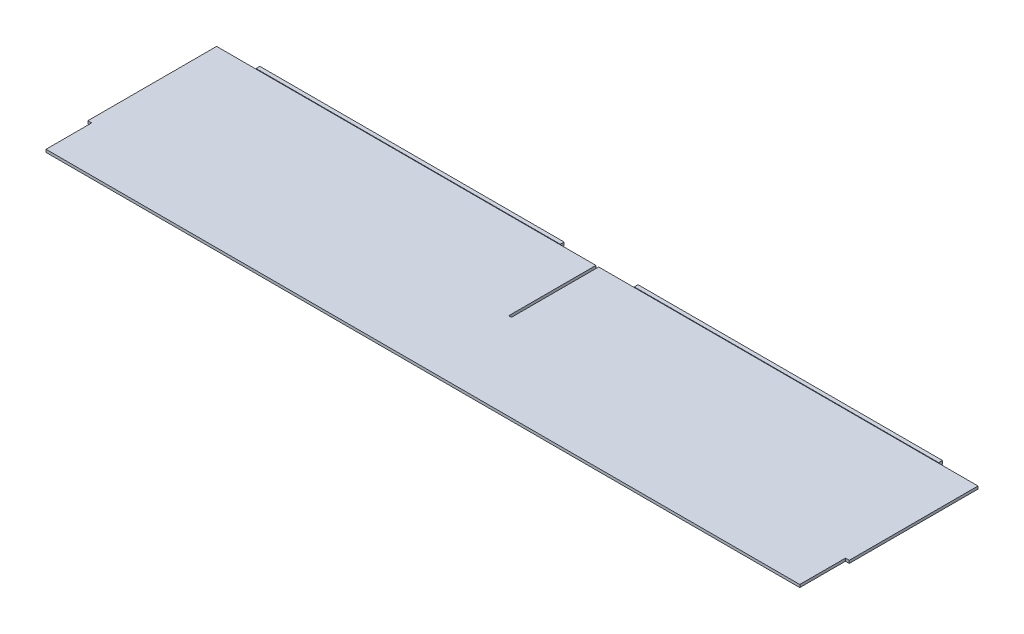
ISO-10303-21;
HEADER;
FILE_DESCRIPTION(('STEP AP214'),'2;1');
FILE_NAME('part.step','',(''),(''),'','','');
FILE_SCHEMA(('AUTOMOTIVE_DESIGN { 1 0 10303 214 1 1 1 1 }'));
ENDSEC;
DATA;
#1=APPLICATION_CONTEXT('core data for automotive mechanical design processes');
#2=APPLICATION_PROTOCOL_DEFINITION('international standard','automotive_design',2000,#1);
#3=PRODUCT_CONTEXT('',#1,'mechanical');
#4=PRODUCT('Part','Part','',(#3));
#5=PRODUCT_RELATED_PRODUCT_CATEGORY('part','',(#4));
#6=PRODUCT_DEFINITION_FORMATION('','',#4);
#7=PRODUCT_DEFINITION_CONTEXT('part definition',#1,'design');
#8=PRODUCT_DEFINITION('design','',#6,#7);
#9=PRODUCT_DEFINITION_SHAPE('','',#8);
#10=(LENGTH_UNIT() NAMED_UNIT(*) SI_UNIT(.MILLI.,.METRE.));
#11=(NAMED_UNIT(*) PLANE_ANGLE_UNIT() SI_UNIT($,.RADIAN.));
#12=(NAMED_UNIT(*) SI_UNIT($,.STERADIAN.) SOLID_ANGLE_UNIT());
#13=UNCERTAINTY_MEASURE_WITH_UNIT(LENGTH_MEASURE(1.E-05),#10,'distance_accuracy_value','');
#14=(GEOMETRIC_REPRESENTATION_CONTEXT(3) GLOBAL_UNCERTAINTY_ASSIGNED_CONTEXT((#13)) GLOBAL_UNIT_ASSIGNED_CONTEXT((#10,
#11,#12)) REPRESENTATION_CONTEXT('',''));
#15=CARTESIAN_POINT('',(0.,0.,0.));
#16=DIRECTION('',(0.,0.,1.));
#17=DIRECTION('',(1.,0.,0.));
#18=AXIS2_PLACEMENT_3D('',#15,#16,#17);
#19=CARTESIAN_POINT('',(-317.6778,1.143,-72.771));
#20=DIRECTION('',(0.,0.,1.));
#21=DIRECTION('',(1.,0.,0.));
#22=AXIS2_PLACEMENT_3D('',#19,#20,#21);
#23=PLANE('',#22);
#24=DIRECTION('',(-1.,0.,0.));
#25=VECTOR('',#24,1.);
#26=CARTESIAN_POINT('',(-317.6778,1.143,-72.771));
#27=LINE('',#26,#25);
#28=CARTESIAN_POINT('',(-1.14299999999998,1.143,-72.771));
#29=VERTEX_POINT('',#28);
#30=CARTESIAN_POINT('',(-30.8229000000015,1.143,-72.771));
#31=VERTEX_POINT('',#30);
#32=EDGE_CURVE('E199',#29,#31,#27,.T.);
#33=ORIENTED_EDGE('',*,*,#32,.F.);
#34=DIRECTION('',(0.,-1.,0.));
#35=VECTOR('',#34,1.);
#36=CARTESIAN_POINT('',(-1.14300000000001,1.143,-72.771));
#37=LINE('',#36,#35);
#38=CARTESIAN_POINT('',(-1.14299999999998,-1.143,-72.771));
#39=VERTEX_POINT('',#38);
#40=EDGE_CURVE('E11',#29,#39,#37,.T.);
#41=ORIENTED_EDGE('',*,*,#40,.T.);
#42=DIRECTION('',(-1.,0.,0.));
#43=VECTOR('',#42,1.);
#44=CARTESIAN_POINT('',(-317.6778,-1.143,-72.771));
#45=LINE('',#44,#43);
#46=CARTESIAN_POINT('',(-30.8229000000015,-1.143,-72.771));
#47=VERTEX_POINT('',#46);
#48=EDGE_CURVE('E197',#39,#47,#45,.T.);
#49=ORIENTED_EDGE('',*,*,#48,.T.);
#50=DIRECTION('',(0.,-1.,0.));
#51=VECTOR('',#50,1.);
#52=CARTESIAN_POINT('',(-30.8229000000015,-1.143,-72.771));
#53=LINE('',#52,#51);
#54=EDGE_CURVE('E231',#31,#47,#53,.T.);
#55=ORIENTED_EDGE('',*,*,#54,.F.);
#56=EDGE_LOOP('',(#33,#41,#49,#55));
#57=FACE_BOUND('',#56,.T.);
#58=ADVANCED_FACE('F33',(#57),#23,.F.);
#59=CARTESIAN_POINT('',(317.6778,1.143,-72.771));
#60=DIRECTION('',(-1.,0.,0.));
#61=DIRECTION('',(0.,0.,1.));
#62=AXIS2_PLACEMENT_3D('',#59,#60,#61);
#63=PLANE('',#62);
#64=DIRECTION('',(0.,-1.,0.));
#65=VECTOR('',#64,1.);
#66=CARTESIAN_POINT('',(317.6778,1.58749999999994,34.671));
#67=LINE('',#66,#65);
#68=CARTESIAN_POINT('',(317.6778,1.143,34.671));
#69=VERTEX_POINT('',#68);
#70=CARTESIAN_POINT('',(317.6778,-1.143,34.671));
#71=VERTEX_POINT('',#70);
#72=EDGE_CURVE('E297',#69,#71,#67,.T.);
#73=ORIENTED_EDGE('',*,*,#72,.T.);
#74=DIRECTION('',(0.,0.,-1.));
#75=VECTOR('',#74,1.);
#76=CARTESIAN_POINT('',(317.6778,-1.143,-72.771));
#77=LINE('',#76,#75);
#78=CARTESIAN_POINT('',(317.6778,-1.143,-72.771));
#79=VERTEX_POINT('',#78);
#80=EDGE_CURVE('E209',#71,#79,#77,.T.);
#81=ORIENTED_EDGE('',*,*,#80,.T.);
#82=DIRECTION('',(0.,-1.,0.));
#83=VECTOR('',#82,1.);
#84=CARTESIAN_POINT('',(317.6778,1.143,-72.771));
#85=LINE('',#84,#83);
#86=CARTESIAN_POINT('',(317.6778,1.143,-72.771));
#87=VERTEX_POINT('',#86);
#88=EDGE_CURVE('E229',#87,#79,#85,.T.);
#89=ORIENTED_EDGE('',*,*,#88,.F.);
#90=DIRECTION('',(0.,0.,-1.));
#91=VECTOR('',#90,1.);
#92=CARTESIAN_POINT('',(317.6778,1.143,-72.771));
#93=LINE('',#92,#91);
#94=EDGE_CURVE('E224',#69,#87,#93,.T.);
#95=ORIENTED_EDGE('',*,*,#94,.F.);
#96=EDGE_LOOP('',(#73,#81,#89,#95));
#97=FACE_BOUND('',#96,.T.);
#98=ADVANCED_FACE('F35',(#97),#63,.F.);
#99=CARTESIAN_POINT('',(-317.6778,1.143,72.771));
#100=DIRECTION('',(0.,0.,-1.));
#101=DIRECTION('',(-1.,0.,0.));
#102=AXIS2_PLACEMENT_3D('',#99,#100,#101);
#103=PLANE('',#102);
#104=DIRECTION('',(0.,-1.,0.));
#105=VECTOR('',#104,1.);
#106=CARTESIAN_POINT('',(314.5028,1.58749999999994,72.771));
#107=LINE('',#106,#105);
#108=CARTESIAN_POINT('',(314.5028,1.143,72.771));
#109=VERTEX_POINT('',#108);
#110=CARTESIAN_POINT('',(314.5028,-1.143,72.771));
#111=VERTEX_POINT('',#110);
#112=EDGE_CURVE('E56',#109,#111,#107,.T.);
#113=ORIENTED_EDGE('',*,*,#112,.F.);
#114=DIRECTION('',(1.,0.,0.));
#115=VECTOR('',#114,1.);
#116=CARTESIAN_POINT('',(-317.6778,1.143,72.771));
#117=LINE('',#116,#115);
#118=CARTESIAN_POINT('',(-314.5028,1.143,72.771));
#119=VERTEX_POINT('',#118);
#120=EDGE_CURVE('E230',#119,#109,#117,.T.);
#121=ORIENTED_EDGE('',*,*,#120,.F.);
#122=DIRECTION('',(0.,-1.,0.));
#123=VECTOR('',#122,1.);
#124=CARTESIAN_POINT('',(-314.5028,1.58749999999994,72.771));
#125=LINE('',#124,#123);
#126=CARTESIAN_POINT('',(-314.5028,-1.143,72.771));
#127=VERTEX_POINT('',#126);
#128=EDGE_CURVE('E321',#119,#127,#125,.T.);
#129=ORIENTED_EDGE('',*,*,#128,.T.);
#130=DIRECTION('',(1.,0.,0.));
#131=VECTOR('',#130,1.);
#132=CARTESIAN_POINT('',(-317.6778,-1.143,72.771));
#133=LINE('',#132,#131);
#134=EDGE_CURVE('E218',#127,#111,#133,.T.);
#135=ORIENTED_EDGE('',*,*,#134,.T.);
#136=EDGE_LOOP('',(#113,#121,#129,#135));
#137=FACE_BOUND('',#136,.T.);
#138=ADVANCED_FACE('F396',(#137),#103,.F.);
#139=CARTESIAN_POINT('',(0.,1.143,0.));
#140=DIRECTION('',(0.,1.,0.));
#141=DIRECTION('',(0.,0.,1.));
#142=AXIS2_PLACEMENT_3D('',#139,#140,#141);
#143=PLANE('',#142);
#144=DIRECTION('',(0.,0.,1.));
#145=VECTOR('',#144,1.);
#146=CARTESIAN_POINT('',(-1.14299999999998,1.143,0.));
#147=LINE('',#146,#145);
#148=CARTESIAN_POINT('',(-1.14299999999998,1.143,0.));
#149=VERTEX_POINT('',#148);
#150=EDGE_CURVE('E402',#29,#149,#147,.T.);
#151=ORIENTED_EDGE('',*,*,#150,.F.);
#152=ORIENTED_EDGE('',*,*,#32,.T.);
#153=CARTESIAN_POINT('',(-284.822900000001,1.143,-72.771));
#154=VERTEX_POINT('',#153);
#155=EDGE_CURVE('E288',#31,#154,#27,.T.);
#156=ORIENTED_EDGE('',*,*,#155,.T.);
#157=CARTESIAN_POINT('',(-317.6778,1.143,-72.771));
#158=VERTEX_POINT('',#157);
#159=EDGE_CURVE('E282',#154,#158,#27,.T.);
#160=ORIENTED_EDGE('',*,*,#159,.T.);
#161=DIRECTION('',(0.,0.,1.));
#162=VECTOR('',#161,1.);
#163=CARTESIAN_POINT('',(-317.6778,1.143,-72.771));
#164=LINE('',#163,#162);
#165=CARTESIAN_POINT('',(-317.6778,1.143,34.671));
#166=VERTEX_POINT('',#165);
#167=EDGE_CURVE('E286',#158,#166,#164,.T.);
#168=ORIENTED_EDGE('',*,*,#167,.T.);
#169=DIRECTION('',(-1.,0.,0.));
#170=VECTOR('',#169,1.);
#171=CARTESIAN_POINT('',(0.,1.143,34.671));
#172=LINE('',#171,#170);
#173=CARTESIAN_POINT('',(-314.5028,1.143,34.671));
#174=VERTEX_POINT('',#173);
#175=EDGE_CURVE('E324',#174,#166,#172,.T.);
#176=ORIENTED_EDGE('',*,*,#175,.F.);
#177=DIRECTION('',(0.,0.,-1.));
#178=VECTOR('',#177,1.);
#179=CARTESIAN_POINT('',(-314.5028,1.143,0.));
#180=LINE('',#179,#178);
#181=EDGE_CURVE('E329',#119,#174,#180,.T.);
#182=ORIENTED_EDGE('',*,*,#181,.F.);
#183=ORIENTED_EDGE('',*,*,#120,.T.);
#184=DIRECTION('',(0.,0.,-1.));
#185=VECTOR('',#184,1.);
#186=CARTESIAN_POINT('',(314.5028,1.143,0.));
#187=LINE('',#186,#185);
#188=CARTESIAN_POINT('',(314.5028,1.143,34.671));
#189=VERTEX_POINT('',#188);
#190=EDGE_CURVE('E308',#109,#189,#187,.T.);
#191=ORIENTED_EDGE('',*,*,#190,.T.);
#192=DIRECTION('',(1.,0.,0.));
#193=VECTOR('',#192,1.);
#194=CARTESIAN_POINT('',(0.,1.143,34.671));
#195=LINE('',#194,#193);
#196=EDGE_CURVE('E307',#189,#69,#195,.T.);
#197=ORIENTED_EDGE('',*,*,#196,.T.);
#198=ORIENTED_EDGE('',*,*,#94,.T.);
#199=CARTESIAN_POINT('',(284.822900000001,1.143,-72.771));
#200=VERTEX_POINT('',#199);
#201=EDGE_CURVE('E283',#87,#200,#27,.T.);
#202=ORIENTED_EDGE('',*,*,#201,.T.);
#203=DIRECTION('',(1.,0.,0.));
#204=VECTOR('',#203,1.);
#205=CARTESIAN_POINT('',(0.,1.143,-72.771));
#206=LINE('',#205,#204);
#207=CARTESIAN_POINT('',(30.8229000000014,1.143,-72.771));
#208=VERTEX_POINT('',#207);
#209=EDGE_CURVE('E241',#208,#200,#206,.T.);
#210=ORIENTED_EDGE('',*,*,#209,.F.);
#211=CARTESIAN_POINT('',(1.14300000000001,1.143,-72.771));
#212=VERTEX_POINT('',#211);
#213=EDGE_CURVE('E287',#208,#212,#27,.T.);
#214=ORIENTED_EDGE('',*,*,#213,.T.);
#215=DIRECTION('',(0.,0.,-1.));
#216=VECTOR('',#215,1.);
#217=CARTESIAN_POINT('',(1.14300000000002,1.143,0.));
#218=LINE('',#217,#216);
#219=CARTESIAN_POINT('',(1.14300000000002,1.143,0.));
#220=VERTEX_POINT('',#219);
#221=EDGE_CURVE('E48',#220,#212,#218,.T.);
#222=ORIENTED_EDGE('',*,*,#221,.F.);
#223=DIRECTION('',(1.,0.,0.));
#224=VECTOR('',#223,1.);
#225=CARTESIAN_POINT('',(0.,1.143,0.));
#226=LINE('',#225,#224);
#227=EDGE_CURVE('E399',#149,#220,#226,.T.);
#228=ORIENTED_EDGE('',*,*,#227,.F.);
#229=EDGE_LOOP('',(#151,#152,#156,#160,#168,#176,#182,#183,#191,#197,#198,#202,#210,#214,#222,#228));
#230=FACE_BOUND('',#229,.T.);
#231=ADVANCED_FACE('F304',(#230),#143,.T.);
#232=CARTESIAN_POINT('',(0.,-1.143,0.));
#233=DIRECTION('',(0.,1.,0.));
#234=DIRECTION('',(0.,0.,1.));
#235=AXIS2_PLACEMENT_3D('',#232,#233,#234);
#236=PLANE('',#235);
#237=ORIENTED_EDGE('',*,*,#48,.F.);
#238=DIRECTION('',(0.,0.,-1.));
#239=VECTOR('',#238,1.);
#240=CARTESIAN_POINT('',(-1.14299999999998,-1.143,-72.771));
#241=LINE('',#240,#239);
#242=CARTESIAN_POINT('',(-1.14299999999998,-1.143,0.));
#243=VERTEX_POINT('',#242);
#244=EDGE_CURVE('E183',#243,#39,#241,.T.);
#245=ORIENTED_EDGE('',*,*,#244,.F.);
#246=DIRECTION('',(-1.,0.,0.));
#247=VECTOR('',#246,1.);
#248=CARTESIAN_POINT('',(-1.14299999999998,-1.143,0.));
#249=LINE('',#248,#247);
#250=CARTESIAN_POINT('',(1.14300000000002,-1.143,0.));
#251=VERTEX_POINT('',#250);
#252=EDGE_CURVE('E526',#251,#243,#249,.T.);
#253=ORIENTED_EDGE('',*,*,#252,.F.);
#254=DIRECTION('',(0.,0.,1.));
#255=VECTOR('',#254,1.);
#256=CARTESIAN_POINT('',(1.14300000000002,-1.143,-72.771));
#257=LINE('',#256,#255);
#258=CARTESIAN_POINT('',(1.14300000000002,-1.143,-72.771));
#259=VERTEX_POINT('',#258);
#260=EDGE_CURVE('E192',#259,#251,#257,.T.);
#261=ORIENTED_EDGE('',*,*,#260,.F.);
#262=CARTESIAN_POINT('',(30.8229000000015,-1.143,-72.771));
#263=VERTEX_POINT('',#262);
#264=EDGE_CURVE('E204',#263,#259,#45,.T.);
#265=ORIENTED_EDGE('',*,*,#264,.F.);
#266=DIRECTION('',(0.,0.,1.));
#267=VECTOR('',#266,1.);
#268=CARTESIAN_POINT('',(30.8229000000015,-1.143,-75.946));
#269=LINE('',#268,#267);
#270=CARTESIAN_POINT('',(30.8229000000015,-1.143,-75.946));
#271=VERTEX_POINT('',#270);
#272=EDGE_CURVE('E254',#271,#263,#269,.T.);
#273=ORIENTED_EDGE('',*,*,#272,.F.);
#274=DIRECTION('',(-1.,0.,0.));
#275=VECTOR('',#274,1.);
#276=CARTESIAN_POINT('',(284.822900000001,-1.143,-75.946));
#277=LINE('',#276,#275);
#278=CARTESIAN_POINT('',(284.822900000001,-1.143,-75.946));
#279=VERTEX_POINT('',#278);
#280=EDGE_CURVE('E334',#279,#271,#277,.T.);
#281=ORIENTED_EDGE('',*,*,#280,.F.);
#282=DIRECTION('',(0.,0.,1.));
#283=VECTOR('',#282,1.);
#284=CARTESIAN_POINT('',(284.822900000001,-1.143,-75.946));
#285=LINE('',#284,#283);
#286=CARTESIAN_POINT('',(284.822900000001,-1.143,-72.771));
#287=VERTEX_POINT('',#286);
#288=EDGE_CURVE('E246',#279,#287,#285,.T.);
#289=ORIENTED_EDGE('',*,*,#288,.T.);
#290=EDGE_CURVE('E207',#79,#287,#45,.T.);
#291=ORIENTED_EDGE('',*,*,#290,.F.);
#292=ORIENTED_EDGE('',*,*,#80,.F.);
#293=DIRECTION('',(-1.,0.,0.));
#294=VECTOR('',#293,1.);
#295=CARTESIAN_POINT('',(317.6778,-1.143,34.671));
#296=LINE('',#295,#294);
#297=CARTESIAN_POINT('',(314.5028,-1.143,34.671));
#298=VERTEX_POINT('',#297);
#299=EDGE_CURVE('E398',#71,#298,#296,.T.);
#300=ORIENTED_EDGE('',*,*,#299,.T.);
#301=DIRECTION('',(0.,0.,1.));
#302=VECTOR('',#301,1.);
#303=CARTESIAN_POINT('',(314.5028,-1.143,72.771));
#304=LINE('',#303,#302);
#305=EDGE_CURVE('E397',#298,#111,#304,.T.);
#306=ORIENTED_EDGE('',*,*,#305,.T.);
#307=ORIENTED_EDGE('',*,*,#134,.F.);
#308=DIRECTION('',(0.,0.,1.));
#309=VECTOR('',#308,1.);
#310=CARTESIAN_POINT('',(-314.5028,-1.143,72.771));
#311=LINE('',#310,#309);
#312=CARTESIAN_POINT('',(-314.5028,-1.143,34.671));
#313=VERTEX_POINT('',#312);
#314=EDGE_CURVE('E314',#313,#127,#311,.T.);
#315=ORIENTED_EDGE('',*,*,#314,.F.);
#316=DIRECTION('',(1.,0.,0.));
#317=VECTOR('',#316,1.);
#318=CARTESIAN_POINT('',(-317.6778,-1.143,34.671));
#319=LINE('',#318,#317);
#320=CARTESIAN_POINT('',(-317.6778,-1.143,34.671));
#321=VERTEX_POINT('',#320);
#322=EDGE_CURVE('E311',#321,#313,#319,.T.);
#323=ORIENTED_EDGE('',*,*,#322,.F.);
#324=DIRECTION('',(0.,0.,1.));
#325=VECTOR('',#324,1.);
#326=CARTESIAN_POINT('',(-317.6778,-1.143,-72.771));
#327=LINE('',#326,#325);
#328=CARTESIAN_POINT('',(-317.6778,-1.143,-72.771));
#329=VERTEX_POINT('',#328);
#330=EDGE_CURVE('E212',#329,#321,#327,.T.);
#331=ORIENTED_EDGE('',*,*,#330,.F.);
#332=CARTESIAN_POINT('',(-284.822900000001,-1.143,-72.771));
#333=VERTEX_POINT('',#332);
#334=EDGE_CURVE('E205',#333,#329,#45,.T.);
#335=ORIENTED_EDGE('',*,*,#334,.F.);
#336=DIRECTION('',(0.,0.,1.));
#337=VECTOR('',#336,1.);
#338=CARTESIAN_POINT('',(-284.822900000001,-1.143,-75.946));
#339=LINE('',#338,#337);
#340=CARTESIAN_POINT('',(-284.822900000001,-1.143,-75.946));
#341=VERTEX_POINT('',#340);
#342=EDGE_CURVE('E274',#341,#333,#339,.T.);
#343=ORIENTED_EDGE('',*,*,#342,.F.);
#344=DIRECTION('',(-1.,0.,0.));
#345=VECTOR('',#344,1.);
#346=CARTESIAN_POINT('',(-30.8229000000015,-1.143,-75.946));
#347=LINE('',#346,#345);
#348=CARTESIAN_POINT('',(-30.8229000000015,-1.143,-75.946));
#349=VERTEX_POINT('',#348);
#350=EDGE_CURVE('E261',#349,#341,#347,.T.);
#351=ORIENTED_EDGE('',*,*,#350,.F.);
#352=DIRECTION('',(0.,0.,1.));
#353=VECTOR('',#352,1.);
#354=CARTESIAN_POINT('',(-30.8229000000015,-1.143,-75.946));
#355=LINE('',#354,#353);
#356=EDGE_CURVE('E203',#349,#47,#355,.T.);
#357=ORIENTED_EDGE('',*,*,#356,.T.);
#358=EDGE_LOOP('',(#237,#245,#253,#261,#265,#273,#281,#289,#291,#292,#300,#306,#307,#315,#323,
#331,#335,#343,#351,#357));
#359=FACE_BOUND('',#358,.T.);
#360=ADVANCED_FACE('F201',(#359),#236,.F.);
#361=DIRECTION('',(0.,-1.,0.));
#362=VECTOR('',#361,1.);
#363=CARTESIAN_POINT('',(284.822900000001,-1.143,-72.771));
#364=LINE('',#363,#362);
#365=EDGE_CURVE('E302',#200,#287,#364,.T.);
#366=ORIENTED_EDGE('',*,*,#365,.F.);
#367=ORIENTED_EDGE('',*,*,#201,.F.);
#368=ORIENTED_EDGE('',*,*,#88,.T.);
#369=ORIENTED_EDGE('',*,*,#290,.T.);
#370=EDGE_LOOP('',(#366,#367,#368,#369));
#371=FACE_BOUND('',#370,.T.);
#372=ADVANCED_FACE('F301',(#371),#23,.F.);
#373=ORIENTED_EDGE('',*,*,#264,.T.);
#374=DIRECTION('',(0.,1.,0.));
#375=VECTOR('',#374,1.);
#376=CARTESIAN_POINT('',(1.14300000000001,1.143,-72.771));
#377=LINE('',#376,#375);
#378=EDGE_CURVE('E41',#259,#212,#377,.T.);
#379=ORIENTED_EDGE('',*,*,#378,.T.);
#380=ORIENTED_EDGE('',*,*,#213,.F.);
#381=DIRECTION('',(0.,1.,0.));
#382=VECTOR('',#381,1.);
#383=CARTESIAN_POINT('',(30.8229000000015,1.58749999999994,-72.771));
#384=LINE('',#383,#382);
#385=EDGE_CURVE('E345',#263,#208,#384,.T.);
#386=ORIENTED_EDGE('',*,*,#385,.F.);
#387=EDGE_LOOP('',(#373,#379,#380,#386));
#388=FACE_BOUND('',#387,.T.);
#389=ADVANCED_FACE('F362',(#388),#23,.F.);
#390=DIRECTION('',(0.,1.,0.));
#391=VECTOR('',#390,1.);
#392=CARTESIAN_POINT('',(-284.822900000001,1.58749999999994,-72.771));
#393=LINE('',#392,#391);
#394=EDGE_CURVE('E244',#333,#154,#393,.T.);
#395=ORIENTED_EDGE('',*,*,#394,.F.);
#396=ORIENTED_EDGE('',*,*,#334,.T.);
#397=DIRECTION('',(0.,-1.,0.));
#398=VECTOR('',#397,1.);
#399=CARTESIAN_POINT('',(-317.6778,1.143,-72.771));
#400=LINE('',#399,#398);
#401=EDGE_CURVE('E227',#158,#329,#400,.T.);
#402=ORIENTED_EDGE('',*,*,#401,.F.);
#403=ORIENTED_EDGE('',*,*,#159,.F.);
#404=EDGE_LOOP('',(#395,#396,#402,#403));
#405=FACE_BOUND('',#404,.T.);
#406=ADVANCED_FACE('F369',(#405),#23,.F.);
#407=CARTESIAN_POINT('',(-317.6778,1.143,-72.771));
#408=DIRECTION('',(1.,0.,0.));
#409=DIRECTION('',(0.,0.,-1.));
#410=AXIS2_PLACEMENT_3D('',#407,#408,#409);
#411=PLANE('',#410);
#412=ORIENTED_EDGE('',*,*,#330,.T.);
#413=DIRECTION('',(0.,-1.,0.));
#414=VECTOR('',#413,1.);
#415=CARTESIAN_POINT('',(-317.6778,1.58749999999994,34.671));
#416=LINE('',#415,#414);
#417=EDGE_CURVE('E320',#166,#321,#416,.T.);
#418=ORIENTED_EDGE('',*,*,#417,.F.);
#419=ORIENTED_EDGE('',*,*,#167,.F.);
#420=ORIENTED_EDGE('',*,*,#401,.T.);
#421=EDGE_LOOP('',(#412,#418,#419,#420));
#422=FACE_BOUND('',#421,.T.);
#423=ADVANCED_FACE('F384',(#422),#411,.F.);
#424=CARTESIAN_POINT('',(0.,0.,-72.771));
#425=DIRECTION('',(0.,0.,1.));
#426=DIRECTION('',(1.,0.,0.));
#427=AXIS2_PLACEMENT_3D('',#424,#425,#426);
#428=PLANE('',#427);
#429=ORIENTED_EDGE('',*,*,#155,.F.);
#430=CARTESIAN_POINT('',(-30.8229000000015,1.58749999999994,-72.771));
#431=VERTEX_POINT('',#430);
#432=EDGE_CURVE('E235',#431,#31,#53,.T.);
#433=ORIENTED_EDGE('',*,*,#432,.F.);
#434=DIRECTION('',(1.,0.,0.));
#435=VECTOR('',#434,1.);
#436=CARTESIAN_POINT('',(-30.8229000000015,1.58749999999994,-72.771));
#437=LINE('',#436,#435);
#438=CARTESIAN_POINT('',(-284.822900000001,1.58749999999994,-72.771));
#439=VERTEX_POINT('',#438);
#440=EDGE_CURVE('E262',#439,#431,#437,.T.);
#441=ORIENTED_EDGE('',*,*,#440,.F.);
#442=EDGE_CURVE('E240',#154,#439,#393,.T.);
#443=ORIENTED_EDGE('',*,*,#442,.F.);
#444=EDGE_LOOP('',(#429,#433,#441,#443));
#445=FACE_BOUND('',#444,.T.);
#446=ADVANCED_FACE('F374',(#445),#428,.T.);
#447=CARTESIAN_POINT('',(-30.8229000000015,-1.143,-75.946));
#448=DIRECTION('',(-1.,0.,0.));
#449=DIRECTION('',(0.,0.,1.));
#450=AXIS2_PLACEMENT_3D('',#447,#448,#449);
#451=PLANE('',#450);
#452=ORIENTED_EDGE('',*,*,#432,.T.);
#453=ORIENTED_EDGE('',*,*,#54,.T.);
#454=ORIENTED_EDGE('',*,*,#356,.F.);
#455=DIRECTION('',(0.,-1.,0.));
#456=VECTOR('',#455,1.);
#457=CARTESIAN_POINT('',(-30.8229000000015,-1.143,-75.946));
#458=LINE('',#457,#456);
#459=CARTESIAN_POINT('',(-30.8229000000015,1.58749999999994,-75.946));
#460=VERTEX_POINT('',#459);
#461=EDGE_CURVE('E258',#460,#349,#458,.T.);
#462=ORIENTED_EDGE('',*,*,#461,.F.);
#463=DIRECTION('',(0.,0.,1.));
#464=VECTOR('',#463,1.);
#465=CARTESIAN_POINT('',(-30.8229000000015,1.58749999999994,-75.946));
#466=LINE('',#465,#464);
#467=EDGE_CURVE('E266',#460,#431,#466,.T.);
#468=ORIENTED_EDGE('',*,*,#467,.T.);
#469=EDGE_LOOP('',(#452,#453,#454,#462,#468));
#470=FACE_BOUND('',#469,.T.);
#471=ADVANCED_FACE('F442',(#470),#451,.F.);
#472=CARTESIAN_POINT('',(-284.822900000001,1.58749999999994,-75.946));
#473=DIRECTION('',(1.,0.,0.));
#474=DIRECTION('',(0.,1.,0.));
#475=AXIS2_PLACEMENT_3D('',#472,#473,#474);
#476=PLANE('',#475);
#477=ORIENTED_EDGE('',*,*,#394,.T.);
#478=ORIENTED_EDGE('',*,*,#442,.T.);
#479=DIRECTION('',(0.,0.,1.));
#480=VECTOR('',#479,1.);
#481=CARTESIAN_POINT('',(-284.822900000001,1.58749999999994,-75.946));
#482=LINE('',#481,#480);
#483=CARTESIAN_POINT('',(-284.822900000001,1.58749999999994,-75.946));
#484=VERTEX_POINT('',#483);
#485=EDGE_CURVE('E270',#484,#439,#482,.T.);
#486=ORIENTED_EDGE('',*,*,#485,.F.);
#487=DIRECTION('',(0.,1.,0.));
#488=VECTOR('',#487,1.);
#489=CARTESIAN_POINT('',(-284.822900000001,1.58749999999994,-75.946));
#490=LINE('',#489,#488);
#491=EDGE_CURVE('E264',#341,#484,#490,.T.);
#492=ORIENTED_EDGE('',*,*,#491,.F.);
#493=ORIENTED_EDGE('',*,*,#342,.T.);
#494=EDGE_LOOP('',(#477,#478,#486,#492,#493));
#495=FACE_BOUND('',#494,.T.);
#496=ADVANCED_FACE('F377',(#495),#476,.F.);
#497=CARTESIAN_POINT('',(-30.8229000000015,1.58749999999994,-75.946));
#498=DIRECTION('',(0.,-1.,0.));
#499=DIRECTION('',(0.,0.,-1.));
#500=AXIS2_PLACEMENT_3D('',#497,#498,#499);
#501=PLANE('',#500);
#502=ORIENTED_EDGE('',*,*,#440,.T.);
#503=ORIENTED_EDGE('',*,*,#467,.F.);
#504=DIRECTION('',(1.,0.,0.));
#505=VECTOR('',#504,1.);
#506=CARTESIAN_POINT('',(-30.8229000000015,1.58749999999994,-75.946));
#507=LINE('',#506,#505);
#508=EDGE_CURVE('E265',#484,#460,#507,.T.);
#509=ORIENTED_EDGE('',*,*,#508,.F.);
#510=ORIENTED_EDGE('',*,*,#485,.T.);
#511=EDGE_LOOP('',(#502,#503,#509,#510));
#512=FACE_BOUND('',#511,.T.);
#513=ADVANCED_FACE('F381',(#512),#501,.F.);
#514=CARTESIAN_POINT('',(0.,0.,-75.946));
#515=DIRECTION('',(0.,0.,1.));
#516=DIRECTION('',(1.,0.,0.));
#517=AXIS2_PLACEMENT_3D('',#514,#515,#516);
#518=PLANE('',#517);
#519=ORIENTED_EDGE('',*,*,#461,.T.);
#520=ORIENTED_EDGE('',*,*,#350,.T.);
#521=ORIENTED_EDGE('',*,*,#491,.T.);
#522=ORIENTED_EDGE('',*,*,#508,.T.);
#523=EDGE_LOOP('',(#519,#520,#521,#522));
#524=FACE_BOUND('',#523,.T.);
#525=ADVANCED_FACE('F382',(#524),#518,.F.);
#526=CARTESIAN_POINT('',(284.822900000001,-1.143,-75.946));
#527=DIRECTION('',(-1.,0.,0.));
#528=DIRECTION('',(0.,-1.,0.));
#529=AXIS2_PLACEMENT_3D('',#526,#527,#528);
#530=PLANE('',#529);
#531=CARTESIAN_POINT('',(284.822900000001,1.58749999999994,-72.771));
#532=VERTEX_POINT('',#531);
#533=EDGE_CURVE('E342',#532,#200,#364,.T.);
#534=ORIENTED_EDGE('',*,*,#533,.T.);
#535=ORIENTED_EDGE('',*,*,#365,.T.);
#536=ORIENTED_EDGE('',*,*,#288,.F.);
#537=DIRECTION('',(0.,-1.,0.));
#538=VECTOR('',#537,1.);
#539=CARTESIAN_POINT('',(284.822900000001,-1.143,-75.946));
#540=LINE('',#539,#538);
#541=CARTESIAN_POINT('',(284.822900000001,1.58749999999994,-75.946));
#542=VERTEX_POINT('',#541);
#543=EDGE_CURVE('E331',#542,#279,#540,.T.);
#544=ORIENTED_EDGE('',*,*,#543,.F.);
#545=DIRECTION('',(0.,0.,1.));
#546=VECTOR('',#545,1.);
#547=CARTESIAN_POINT('',(284.822900000001,1.58749999999994,-75.946));
#548=LINE('',#547,#546);
#549=EDGE_CURVE('E341',#542,#532,#548,.T.);
#550=ORIENTED_EDGE('',*,*,#549,.T.);
#551=EDGE_LOOP('',(#534,#535,#536,#544,#550));
#552=FACE_BOUND('',#551,.T.);
#553=ADVANCED_FACE('F456',(#552),#530,.F.);
#554=CARTESIAN_POINT('',(30.8229000000015,1.58749999999994,-75.946));
#555=DIRECTION('',(1.,0.,0.));
#556=DIRECTION('',(0.,0.,-1.));
#557=AXIS2_PLACEMENT_3D('',#554,#555,#556);
#558=PLANE('',#557);
#559=ORIENTED_EDGE('',*,*,#385,.T.);
#560=CARTESIAN_POINT('',(30.8229000000015,1.58749999999994,-72.771));
#561=VERTEX_POINT('',#560);
#562=EDGE_CURVE('E344',#208,#561,#384,.T.);
#563=ORIENTED_EDGE('',*,*,#562,.T.);
#564=DIRECTION('',(0.,0.,1.));
#565=VECTOR('',#564,1.);
#566=CARTESIAN_POINT('',(30.8229000000015,1.58749999999994,-75.946));
#567=LINE('',#566,#565);
#568=CARTESIAN_POINT('',(30.8229000000015,1.58749999999994,-75.946));
#569=VERTEX_POINT('',#568);
#570=EDGE_CURVE('E351',#569,#561,#567,.T.);
#571=ORIENTED_EDGE('',*,*,#570,.F.);
#572=DIRECTION('',(0.,1.,0.));
#573=VECTOR('',#572,1.);
#574=CARTESIAN_POINT('',(30.8229000000015,1.58749999999994,-75.946));
#575=LINE('',#574,#573);
#576=EDGE_CURVE('E337',#271,#569,#575,.T.);
#577=ORIENTED_EDGE('',*,*,#576,.F.);
#578=ORIENTED_EDGE('',*,*,#272,.T.);
#579=EDGE_LOOP('',(#559,#563,#571,#577,#578));
#580=FACE_BOUND('',#579,.T.);
#581=ADVANCED_FACE('F357',(#580),#558,.F.);
#582=CARTESIAN_POINT('',(284.822900000001,1.58749999999994,-75.946));
#583=DIRECTION('',(0.,-1.,0.));
#584=DIRECTION('',(0.,0.,-1.));
#585=AXIS2_PLACEMENT_3D('',#582,#583,#584);
#586=PLANE('',#585);
#587=DIRECTION('',(1.,0.,0.));
#588=VECTOR('',#587,1.);
#589=CARTESIAN_POINT('',(284.822900000001,1.58749999999994,-72.771));
#590=LINE('',#589,#588);
#591=EDGE_CURVE('E335',#561,#532,#590,.T.);
#592=ORIENTED_EDGE('',*,*,#591,.T.);
#593=ORIENTED_EDGE('',*,*,#549,.F.);
#594=DIRECTION('',(1.,0.,0.));
#595=VECTOR('',#594,1.);
#596=CARTESIAN_POINT('',(284.822900000001,1.58749999999994,-75.946));
#597=LINE('',#596,#595);
#598=EDGE_CURVE('E339',#569,#542,#597,.T.);
#599=ORIENTED_EDGE('',*,*,#598,.F.);
#600=ORIENTED_EDGE('',*,*,#570,.T.);
#601=EDGE_LOOP('',(#592,#593,#599,#600));
#602=FACE_BOUND('',#601,.T.);
#603=ADVANCED_FACE('F462',(#602),#586,.F.);
#604=CARTESIAN_POINT('',(0.,0.,-75.946));
#605=DIRECTION('',(0.,0.,1.));
#606=DIRECTION('',(1.,0.,0.));
#607=AXIS2_PLACEMENT_3D('',#604,#605,#606);
#608=PLANE('',#607);
#609=ORIENTED_EDGE('',*,*,#543,.T.);
#610=ORIENTED_EDGE('',*,*,#280,.T.);
#611=ORIENTED_EDGE('',*,*,#576,.T.);
#612=ORIENTED_EDGE('',*,*,#598,.T.);
#613=EDGE_LOOP('',(#609,#610,#611,#612));
#614=FACE_BOUND('',#613,.T.);
#615=ADVANCED_FACE('F465',(#614),#608,.F.);
#616=CARTESIAN_POINT('',(0.,0.,-72.771));
#617=DIRECTION('',(0.,0.,1.));
#618=DIRECTION('',(1.,0.,0.));
#619=AXIS2_PLACEMENT_3D('',#616,#617,#618);
#620=PLANE('',#619);
#621=ORIENTED_EDGE('',*,*,#562,.F.);
#622=ORIENTED_EDGE('',*,*,#209,.T.);
#623=ORIENTED_EDGE('',*,*,#533,.F.);
#624=ORIENTED_EDGE('',*,*,#591,.F.);
#625=EDGE_LOOP('',(#621,#622,#623,#624));
#626=FACE_BOUND('',#625,.T.);
#627=ADVANCED_FACE('F467',(#626),#620,.T.);
#628=CARTESIAN_POINT('',(-314.5028,1.58749999999994,72.771));
#629=DIRECTION('',(1.,0.,0.));
#630=DIRECTION('',(0.,0.,-1.));
#631=AXIS2_PLACEMENT_3D('',#628,#629,#630);
#632=PLANE('',#631);
#633=ORIENTED_EDGE('',*,*,#181,.T.);
#634=DIRECTION('',(0.,-1.,0.));
#635=VECTOR('',#634,1.);
#636=CARTESIAN_POINT('',(-314.5028,1.58749999999994,34.671));
#637=LINE('',#636,#635);
#638=EDGE_CURVE('E325',#174,#313,#637,.T.);
#639=ORIENTED_EDGE('',*,*,#638,.T.);
#640=ORIENTED_EDGE('',*,*,#314,.T.);
#641=ORIENTED_EDGE('',*,*,#128,.F.);
#642=EDGE_LOOP('',(#633,#639,#640,#641));
#643=FACE_BOUND('',#642,.T.);
#644=ADVANCED_FACE('F393',(#643),#632,.F.);
#645=CARTESIAN_POINT('',(-317.6778,1.58749999999994,34.671));
#646=DIRECTION('',(0.,0.,-1.));
#647=DIRECTION('',(-1.,0.,0.));
#648=AXIS2_PLACEMENT_3D('',#645,#646,#647);
#649=PLANE('',#648);
#650=ORIENTED_EDGE('',*,*,#175,.T.);
#651=ORIENTED_EDGE('',*,*,#417,.T.);
#652=ORIENTED_EDGE('',*,*,#322,.T.);
#653=ORIENTED_EDGE('',*,*,#638,.F.);
#654=EDGE_LOOP('',(#650,#651,#652,#653));
#655=FACE_BOUND('',#654,.T.);
#656=ADVANCED_FACE('F390',(#655),#649,.F.);
#657=CARTESIAN_POINT('',(317.6778,1.58749999999994,34.671));
#658=DIRECTION('',(0.,0.,1.));
#659=DIRECTION('',(1.,0.,0.));
#660=AXIS2_PLACEMENT_3D('',#657,#658,#659);
#661=PLANE('',#660);
#662=DIRECTION('',(0.,-1.,0.));
#663=VECTOR('',#662,1.);
#664=CARTESIAN_POINT('',(314.5028,1.58749999999994,34.671));
#665=LINE('',#664,#663);
#666=EDGE_CURVE('E407',#189,#298,#665,.T.);
#667=ORIENTED_EDGE('',*,*,#666,.T.);
#668=ORIENTED_EDGE('',*,*,#299,.F.);
#669=ORIENTED_EDGE('',*,*,#72,.F.);
#670=ORIENTED_EDGE('',*,*,#196,.F.);
#671=EDGE_LOOP('',(#667,#668,#669,#670));
#672=FACE_BOUND('',#671,.T.);
#673=ADVANCED_FACE('F408',(#672),#661,.T.);
#674=CARTESIAN_POINT('',(314.5028,1.58749999999994,72.771));
#675=DIRECTION('',(1.,0.,0.));
#676=DIRECTION('',(0.,0.,-1.));
#677=AXIS2_PLACEMENT_3D('',#674,#675,#676);
#678=PLANE('',#677);
#679=ORIENTED_EDGE('',*,*,#112,.T.);
#680=ORIENTED_EDGE('',*,*,#305,.F.);
#681=ORIENTED_EDGE('',*,*,#666,.F.);
#682=ORIENTED_EDGE('',*,*,#190,.F.);
#683=EDGE_LOOP('',(#679,#680,#681,#682));
#684=FACE_BOUND('',#683,.T.);
#685=ADVANCED_FACE('F409',(#684),#678,.T.);
#686=CARTESIAN_POINT('',(-1.14299999999998,1.58749999999994,-72.771));
#687=DIRECTION('',(-1.,0.,0.));
#688=DIRECTION('',(0.,0.,1.));
#689=AXIS2_PLACEMENT_3D('',#686,#687,#688);
#690=PLANE('',#689);
#691=ORIENTED_EDGE('',*,*,#150,.T.);
#692=DIRECTION('',(0.,-1.,0.));
#693=VECTOR('',#692,1.);
#694=CARTESIAN_POINT('',(-1.14299999999998,1.58749999999994,0.));
#695=LINE('',#694,#693);
#696=EDGE_CURVE('E187',#149,#243,#695,.T.);
#697=ORIENTED_EDGE('',*,*,#696,.T.);
#698=ORIENTED_EDGE('',*,*,#244,.T.);
#699=ORIENTED_EDGE('',*,*,#40,.F.);
#700=EDGE_LOOP('',(#691,#697,#698,#699));
#701=FACE_BOUND('',#700,.T.);
#702=ADVANCED_FACE('F184',(#701),#690,.F.);
#703=CARTESIAN_POINT('',(-1.14299999999998,1.58749999999994,0.));
#704=DIRECTION('',(0.,0.,1.));
#705=DIRECTION('',(1.,0.,0.));
#706=AXIS2_PLACEMENT_3D('',#703,#704,#705);
#707=PLANE('',#706);
#708=ORIENTED_EDGE('',*,*,#227,.T.);
#709=DIRECTION('',(0.,-1.,0.));
#710=VECTOR('',#709,1.);
#711=CARTESIAN_POINT('',(1.14300000000002,1.58749999999994,0.));
#712=LINE('',#711,#710);
#713=EDGE_CURVE('E525',#220,#251,#712,.T.);
#714=ORIENTED_EDGE('',*,*,#713,.T.);
#715=ORIENTED_EDGE('',*,*,#252,.T.);
#716=ORIENTED_EDGE('',*,*,#696,.F.);
#717=EDGE_LOOP('',(#708,#714,#715,#716));
#718=FACE_BOUND('',#717,.T.);
#719=ADVANCED_FACE('F416',(#718),#707,.F.);
#720=CARTESIAN_POINT('',(1.14300000000002,1.58749999999994,-72.771));
#721=DIRECTION('',(1.,0.,0.));
#722=DIRECTION('',(0.,0.,-1.));
#723=AXIS2_PLACEMENT_3D('',#720,#721,#722);
#724=PLANE('',#723);
#725=ORIENTED_EDGE('',*,*,#221,.T.);
#726=ORIENTED_EDGE('',*,*,#378,.F.);
#727=ORIENTED_EDGE('',*,*,#260,.T.);
#728=ORIENTED_EDGE('',*,*,#713,.F.);
#729=EDGE_LOOP('',(#725,#726,#727,#728));
#730=FACE_BOUND('',#729,.T.);
#731=ADVANCED_FACE('F511',(#730),#724,.F.);
#732=CLOSED_SHELL('',(#58,#98,#138,#231,#360,#372,#389,#406,#423,#446,#471,#496,#513,#525,#553,
#581,#603,#615,#627,#644,#656,#673,#685,#702,#719,#731));
#733=MANIFOLD_SOLID_BREP('B2',#732);
#734=ADVANCED_BREP_SHAPE_REPRESENTATION('',(#18,#733),#14);
#735=SHAPE_DEFINITION_REPRESENTATION(#9,#734);
ENDSEC;
END-ISO-10303-21;
